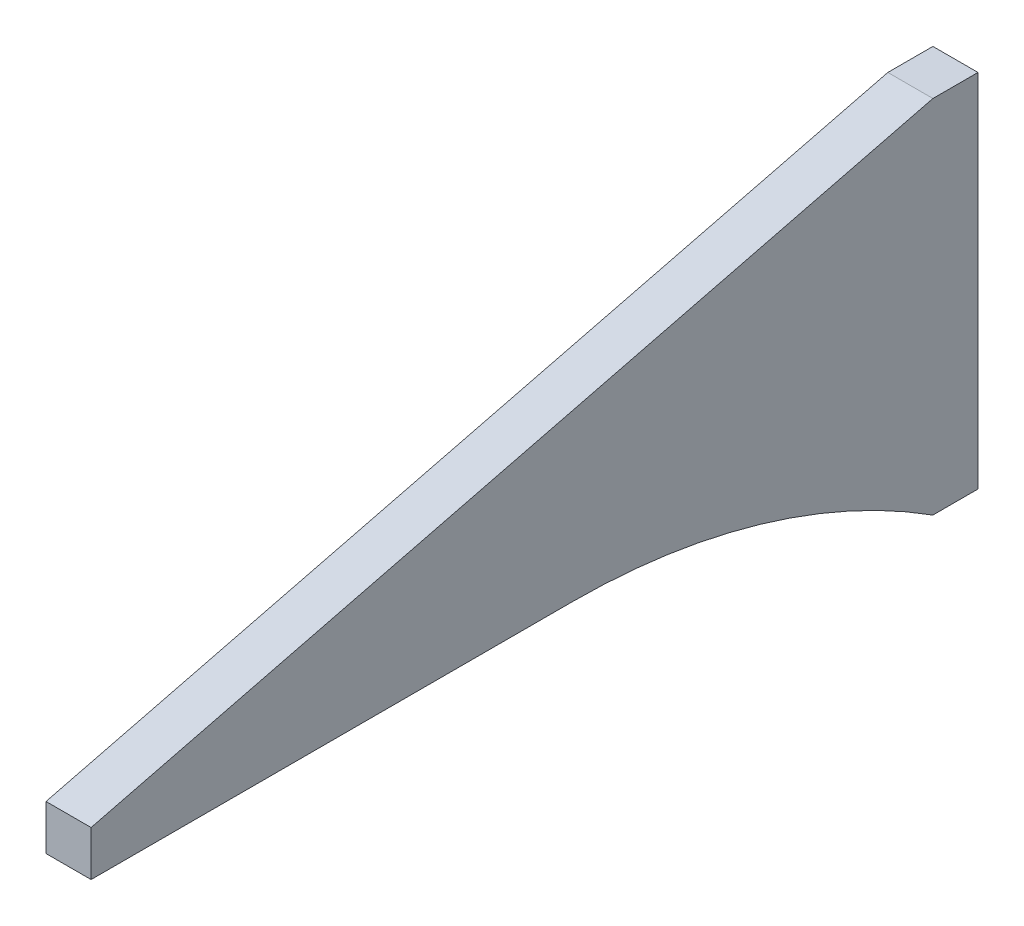
ISO-10303-21;
HEADER;
FILE_DESCRIPTION(('STEP AP214'),'2;1');
FILE_NAME('part.step','',(''),(''),'','','');
FILE_SCHEMA(('AUTOMOTIVE_DESIGN { 1 0 10303 214 1 1 1 1 }'));
ENDSEC;
DATA;
#1=APPLICATION_CONTEXT('core data for automotive mechanical design processes');
#2=APPLICATION_PROTOCOL_DEFINITION('international standard','automotive_design',2000,#1);
#3=PRODUCT_CONTEXT('',#1,'mechanical');
#4=PRODUCT('Part','Part','',(#3));
#5=PRODUCT_RELATED_PRODUCT_CATEGORY('part','',(#4));
#6=PRODUCT_DEFINITION_FORMATION('','',#4);
#7=PRODUCT_DEFINITION_CONTEXT('part definition',#1,'design');
#8=PRODUCT_DEFINITION('design','',#6,#7);
#9=PRODUCT_DEFINITION_SHAPE('','',#8);
#10=(LENGTH_UNIT() NAMED_UNIT(*) SI_UNIT(.MILLI.,.METRE.));
#11=(NAMED_UNIT(*) PLANE_ANGLE_UNIT() SI_UNIT($,.RADIAN.));
#12=(NAMED_UNIT(*) SI_UNIT($,.STERADIAN.) SOLID_ANGLE_UNIT());
#13=UNCERTAINTY_MEASURE_WITH_UNIT(LENGTH_MEASURE(1.E-05),#10,'distance_accuracy_value','');
#14=(GEOMETRIC_REPRESENTATION_CONTEXT(3) GLOBAL_UNCERTAINTY_ASSIGNED_CONTEXT((#13)) GLOBAL_UNIT_ASSIGNED_CONTEXT((#10,
#11,#12)) REPRESENTATION_CONTEXT('',''));
#15=CARTESIAN_POINT('',(0.,0.,0.));
#16=DIRECTION('',(0.,0.,1.));
#17=DIRECTION('',(1.,0.,0.));
#18=AXIS2_PLACEMENT_3D('',#15,#16,#17);
#19=CARTESIAN_POINT('',(19.05,0.,0.));
#20=DIRECTION('',(0.,0.,-1.));
#21=DIRECTION('',(-1.,0.,0.));
#22=AXIS2_PLACEMENT_3D('',#19,#20,#21);
#23=PLANE('',#22);
#24=DIRECTION('',(0.,-1.,0.));
#25=VECTOR('',#24,1.);
#26=CARTESIAN_POINT('',(0.,0.,0.));
#27=LINE('',#26,#25);
#28=CARTESIAN_POINT('',(0.,19.05,0.));
#29=VERTEX_POINT('',#28);
#30=CARTESIAN_POINT('',(0.,0.,0.));
#31=VERTEX_POINT('',#30);
#32=EDGE_CURVE('E122',#29,#31,#27,.T.);
#33=ORIENTED_EDGE('',*,*,#32,.T.);
#34=DIRECTION('',(-1.,0.,0.));
#35=VECTOR('',#34,1.);
#36=CARTESIAN_POINT('',(19.05,0.,0.));
#37=LINE('',#36,#35);
#38=CARTESIAN_POINT('',(19.05,0.,0.));
#39=VERTEX_POINT('',#38);
#40=EDGE_CURVE('E11',#39,#31,#37,.T.);
#41=ORIENTED_EDGE('',*,*,#40,.F.);
#42=DIRECTION('',(0.,-1.,0.));
#43=VECTOR('',#42,1.);
#44=CARTESIAN_POINT('',(19.05,0.,0.));
#45=LINE('',#44,#43);
#46=CARTESIAN_POINT('',(19.05,19.05,0.));
#47=VERTEX_POINT('',#46);
#48=EDGE_CURVE('E134',#47,#39,#45,.T.);
#49=ORIENTED_EDGE('',*,*,#48,.F.);
#50=DIRECTION('',(-1.,0.,0.));
#51=VECTOR('',#50,1.);
#52=CARTESIAN_POINT('',(19.05,19.05,0.));
#53=LINE('',#52,#51);
#54=EDGE_CURVE('E118',#47,#29,#53,.T.);
#55=ORIENTED_EDGE('',*,*,#54,.T.);
#56=EDGE_LOOP('',(#33,#41,#49,#55));
#57=FACE_BOUND('',#56,.T.);
#58=ADVANCED_FACE('F32',(#57),#23,.F.);
#59=CARTESIAN_POINT('',(19.05,0.,0.));
#60=DIRECTION('',(0.,1.,0.));
#61=DIRECTION('',(0.,0.,1.));
#62=AXIS2_PLACEMENT_3D('',#59,#60,#61);
#63=PLANE('',#62);
#64=DIRECTION('',(0.,0.,-1.));
#65=VECTOR('',#64,1.);
#66=CARTESIAN_POINT('',(0.,0.,0.));
#67=LINE('',#66,#65);
#68=CARTESIAN_POINT('',(0.,0.,-203.2));
#69=VERTEX_POINT('',#68);
#70=EDGE_CURVE('E125',#31,#69,#67,.T.);
#71=ORIENTED_EDGE('',*,*,#70,.T.);
#72=DIRECTION('',(-1.,0.,0.));
#73=VECTOR('',#72,1.);
#74=CARTESIAN_POINT('',(19.05,0.,-203.2));
#75=LINE('',#74,#73);
#76=CARTESIAN_POINT('',(19.05,0.,-203.2));
#77=VERTEX_POINT('',#76);
#78=EDGE_CURVE('E40',#77,#69,#75,.T.);
#79=ORIENTED_EDGE('',*,*,#78,.F.);
#80=DIRECTION('',(0.,0.,-1.));
#81=VECTOR('',#80,1.);
#82=CARTESIAN_POINT('',(19.05,0.,0.));
#83=LINE('',#82,#81);
#84=EDGE_CURVE('E88',#39,#77,#83,.T.);
#85=ORIENTED_EDGE('',*,*,#84,.F.);
#86=ORIENTED_EDGE('',*,*,#40,.T.);
#87=EDGE_LOOP('',(#71,#79,#85,#86));
#88=FACE_BOUND('',#87,.T.);
#89=ADVANCED_FACE('F159',(#88),#63,.F.);
#90=CARTESIAN_POINT('',(19.05,-283.482142857143,-203.2));
#91=DIRECTION('',(-1.,0.,0.));
#92=DIRECTION('',(0.,0.,1.));
#93=AXIS2_PLACEMENT_3D('',#90,#91,#92);
#94=CYLINDRICAL_SURFACE('',#93,283.482142857143);
#95=CARTESIAN_POINT('',(0.,-283.482142857143,-203.2));
#96=DIRECTION('',(-1.,0.,0.));
#97=DIRECTION('',(0.,0.,1.));
#98=AXIS2_PLACEMENT_3D('',#95,#96,#97);
#99=CIRCLE('',#98,283.482142857143);
#100=CARTESIAN_POINT('',(0.,-44.45,-355.6));
#101=VERTEX_POINT('',#100);
#102=EDGE_CURVE('E127',#69,#101,#99,.T.);
#103=ORIENTED_EDGE('',*,*,#102,.T.);
#104=DIRECTION('',(-1.,0.,0.));
#105=VECTOR('',#104,1.);
#106=CARTESIAN_POINT('',(19.05,-44.45,-355.6));
#107=LINE('',#106,#105);
#108=CARTESIAN_POINT('',(19.05,-44.45,-355.6));
#109=VERTEX_POINT('',#108);
#110=EDGE_CURVE('E138',#109,#101,#107,.T.);
#111=ORIENTED_EDGE('',*,*,#110,.F.);
#112=CARTESIAN_POINT('',(19.05,-283.482142857143,-203.2));
#113=DIRECTION('',(-1.,0.,0.));
#114=DIRECTION('',(0.,0.,1.));
#115=AXIS2_PLACEMENT_3D('',#112,#113,#114);
#116=CIRCLE('',#115,283.482142857143);
#117=EDGE_CURVE('E146',#77,#109,#116,.T.);
#118=ORIENTED_EDGE('',*,*,#117,.F.);
#119=ORIENTED_EDGE('',*,*,#78,.T.);
#120=EDGE_LOOP('',(#103,#111,#118,#119));
#121=FACE_BOUND('',#120,.T.);
#122=ADVANCED_FACE('F144',(#121),#94,.F.);
#123=CARTESIAN_POINT('',(19.05,-44.45,-374.65));
#124=DIRECTION('',(0.,1.,0.));
#125=DIRECTION('',(0.,0.,1.));
#126=AXIS2_PLACEMENT_3D('',#123,#124,#125);
#127=PLANE('',#126);
#128=DIRECTION('',(0.,0.,-1.));
#129=VECTOR('',#128,1.);
#130=CARTESIAN_POINT('',(0.,-44.45,-374.65));
#131=LINE('',#130,#129);
#132=CARTESIAN_POINT('',(0.,-44.45,-374.65));
#133=VERTEX_POINT('',#132);
#134=EDGE_CURVE('E129',#101,#133,#131,.T.);
#135=ORIENTED_EDGE('',*,*,#134,.T.);
#136=DIRECTION('',(-1.,0.,0.));
#137=VECTOR('',#136,1.);
#138=CARTESIAN_POINT('',(19.05,-44.45,-374.65));
#139=LINE('',#138,#137);
#140=CARTESIAN_POINT('',(19.05,-44.45,-374.65));
#141=VERTEX_POINT('',#140);
#142=EDGE_CURVE('E113',#141,#133,#139,.T.);
#143=ORIENTED_EDGE('',*,*,#142,.F.);
#144=DIRECTION('',(0.,0.,-1.));
#145=VECTOR('',#144,1.);
#146=CARTESIAN_POINT('',(19.05,-44.45,-374.65));
#147=LINE('',#146,#145);
#148=EDGE_CURVE('E104',#109,#141,#147,.T.);
#149=ORIENTED_EDGE('',*,*,#148,.F.);
#150=ORIENTED_EDGE('',*,*,#110,.T.);
#151=EDGE_LOOP('',(#135,#143,#149,#150));
#152=FACE_BOUND('',#151,.T.);
#153=ADVANCED_FACE('F152',(#152),#127,.F.);
#154=CARTESIAN_POINT('',(19.05,107.95,-374.65));
#155=DIRECTION('',(0.,0.,1.));
#156=DIRECTION('',(0.,-1.,0.));
#157=AXIS2_PLACEMENT_3D('',#154,#155,#156);
#158=PLANE('',#157);
#159=DIRECTION('',(0.,1.,0.));
#160=VECTOR('',#159,1.);
#161=CARTESIAN_POINT('',(0.,107.95,-374.65));
#162=LINE('',#161,#160);
#163=CARTESIAN_POINT('',(0.,107.95,-374.65));
#164=VERTEX_POINT('',#163);
#165=EDGE_CURVE('E112',#133,#164,#162,.T.);
#166=ORIENTED_EDGE('',*,*,#165,.T.);
#167=DIRECTION('',(-1.,0.,0.));
#168=VECTOR('',#167,1.);
#169=CARTESIAN_POINT('',(19.05,107.95,-374.65));
#170=LINE('',#169,#168);
#171=CARTESIAN_POINT('',(19.05,107.95,-374.65));
#172=VERTEX_POINT('',#171);
#173=EDGE_CURVE('E109',#172,#164,#170,.T.);
#174=ORIENTED_EDGE('',*,*,#173,.F.);
#175=DIRECTION('',(0.,1.,0.));
#176=VECTOR('',#175,1.);
#177=CARTESIAN_POINT('',(19.05,107.95,-374.65));
#178=LINE('',#177,#176);
#179=EDGE_CURVE('E98',#141,#172,#178,.T.);
#180=ORIENTED_EDGE('',*,*,#179,.F.);
#181=ORIENTED_EDGE('',*,*,#142,.T.);
#182=EDGE_LOOP('',(#166,#174,#180,#181));
#183=FACE_BOUND('',#182,.T.);
#184=ADVANCED_FACE('F110',(#183),#158,.F.);
#185=CARTESIAN_POINT('',(19.05,107.95,-374.65));
#186=DIRECTION('',(0.,-1.,0.));
#187=DIRECTION('',(0.,0.,-1.));
#188=AXIS2_PLACEMENT_3D('',#185,#186,#187);
#189=PLANE('',#188);
#190=DIRECTION('',(0.,0.,1.));
#191=VECTOR('',#190,1.);
#192=CARTESIAN_POINT('',(0.,107.95,-374.65));
#193=LINE('',#192,#191);
#194=CARTESIAN_POINT('',(0.,107.95,-355.6));
#195=VERTEX_POINT('',#194);
#196=EDGE_CURVE('E74',#164,#195,#193,.T.);
#197=ORIENTED_EDGE('',*,*,#196,.T.);
#198=DIRECTION('',(-1.,0.,0.));
#199=VECTOR('',#198,1.);
#200=CARTESIAN_POINT('',(19.05,107.95,-355.6));
#201=LINE('',#200,#199);
#202=CARTESIAN_POINT('',(19.05,107.95,-355.6));
#203=VERTEX_POINT('',#202);
#204=EDGE_CURVE('E114',#203,#195,#201,.T.);
#205=ORIENTED_EDGE('',*,*,#204,.F.);
#206=DIRECTION('',(0.,0.,1.));
#207=VECTOR('',#206,1.);
#208=CARTESIAN_POINT('',(19.05,107.95,-374.65));
#209=LINE('',#208,#207);
#210=EDGE_CURVE('E102',#172,#203,#209,.T.);
#211=ORIENTED_EDGE('',*,*,#210,.F.);
#212=ORIENTED_EDGE('',*,*,#173,.T.);
#213=EDGE_LOOP('',(#197,#205,#211,#212));
#214=FACE_BOUND('',#213,.T.);
#215=ADVANCED_FACE('F116',(#214),#189,.F.);
#216=CARTESIAN_POINT('',(19.05,107.95,-355.6));
#217=DIRECTION('',(0.,-0.970142500145332,-0.242535625036333));
#218=DIRECTION('',(0.,0.242535625036333,-0.970142500145332));
#219=AXIS2_PLACEMENT_3D('',#216,#217,#218);
#220=PLANE('',#219);
#221=DIRECTION('',(0.,-0.242535625036333,0.970142500145332));
#222=VECTOR('',#221,1.);
#223=CARTESIAN_POINT('',(0.,107.95,-355.6));
#224=LINE('',#223,#222);
#225=EDGE_CURVE('E80',#195,#29,#224,.T.);
#226=ORIENTED_EDGE('',*,*,#225,.T.);
#227=ORIENTED_EDGE('',*,*,#54,.F.);
#228=DIRECTION('',(0.,-0.242535625036333,0.970142500145332));
#229=VECTOR('',#228,1.);
#230=CARTESIAN_POINT('',(19.05,107.95,-355.6));
#231=LINE('',#230,#229);
#232=EDGE_CURVE('E48',#203,#47,#231,.T.);
#233=ORIENTED_EDGE('',*,*,#232,.F.);
#234=ORIENTED_EDGE('',*,*,#204,.T.);
#235=EDGE_LOOP('',(#226,#227,#233,#234));
#236=FACE_BOUND('',#235,.T.);
#237=ADVANCED_FACE('F173',(#236),#220,.F.);
#238=CARTESIAN_POINT('',(19.05,-283.482142857143,-203.2));
#239=DIRECTION('',(-1.,0.,0.));
#240=DIRECTION('',(0.,0.,1.));
#241=AXIS2_PLACEMENT_3D('',#238,#239,#240);
#242=PLANE('',#241);
#243=ORIENTED_EDGE('',*,*,#48,.T.);
#244=ORIENTED_EDGE('',*,*,#84,.T.);
#245=ORIENTED_EDGE('',*,*,#117,.T.);
#246=ORIENTED_EDGE('',*,*,#148,.T.);
#247=ORIENTED_EDGE('',*,*,#179,.T.);
#248=ORIENTED_EDGE('',*,*,#210,.T.);
#249=ORIENTED_EDGE('',*,*,#232,.T.);
#250=EDGE_LOOP('',(#243,#244,#245,#246,#247,#248,#249));
#251=FACE_BOUND('',#250,.T.);
#252=ADVANCED_FACE('F100',(#251),#242,.F.);
#253=CARTESIAN_POINT('',(0.,-283.482142857143,-203.2));
#254=DIRECTION('',(-1.,0.,0.));
#255=DIRECTION('',(0.,0.,1.));
#256=AXIS2_PLACEMENT_3D('',#253,#254,#255);
#257=PLANE('',#256);
#258=ORIENTED_EDGE('',*,*,#32,.F.);
#259=ORIENTED_EDGE('',*,*,#225,.F.);
#260=ORIENTED_EDGE('',*,*,#196,.F.);
#261=ORIENTED_EDGE('',*,*,#165,.F.);
#262=ORIENTED_EDGE('',*,*,#134,.F.);
#263=ORIENTED_EDGE('',*,*,#102,.F.);
#264=ORIENTED_EDGE('',*,*,#70,.F.);
#265=EDGE_LOOP('',(#258,#259,#260,#261,#262,#263,#264));
#266=FACE_BOUND('',#265,.T.);
#267=ADVANCED_FACE('F150',(#266),#257,.T.);
#268=CLOSED_SHELL('',(#58,#89,#122,#153,#184,#215,#237,#252,#267));
#269=MANIFOLD_SOLID_BREP('B2',#268);
#270=ADVANCED_BREP_SHAPE_REPRESENTATION('',(#18,#269),#14);
#271=SHAPE_DEFINITION_REPRESENTATION(#9,#270);
ENDSEC;
END-ISO-10303-21;
